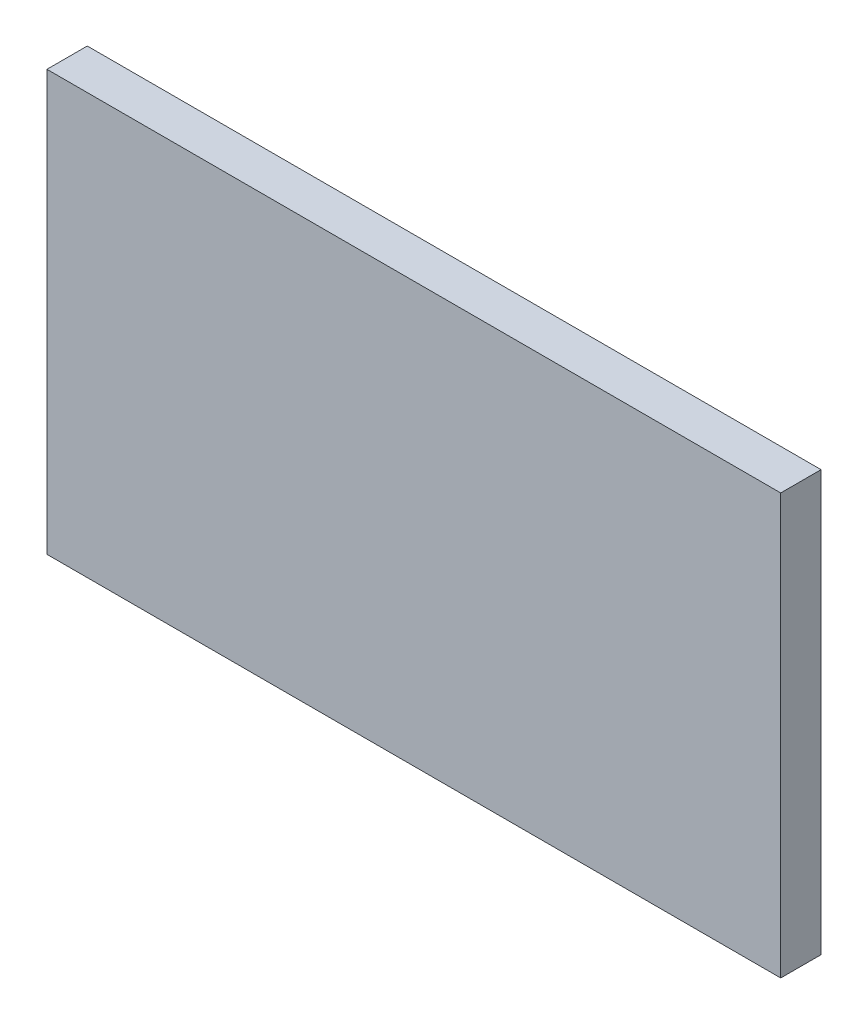
ISO-10303-21;
HEADER;
FILE_DESCRIPTION(('STEP AP214'),'2;1');
FILE_NAME('part.step','',(''),(''),'','','');
FILE_SCHEMA(('AUTOMOTIVE_DESIGN { 1 0 10303 214 1 1 1 1 }'));
ENDSEC;
DATA;
#1=APPLICATION_CONTEXT('core data for automotive mechanical design processes');
#2=APPLICATION_PROTOCOL_DEFINITION('international standard','automotive_design',2000,#1);
#3=PRODUCT_CONTEXT('',#1,'mechanical');
#4=PRODUCT('Part','Part','',(#3));
#5=PRODUCT_RELATED_PRODUCT_CATEGORY('part','',(#4));
#6=PRODUCT_DEFINITION_FORMATION('','',#4);
#7=PRODUCT_DEFINITION_CONTEXT('part definition',#1,'design');
#8=PRODUCT_DEFINITION('design','',#6,#7);
#9=PRODUCT_DEFINITION_SHAPE('','',#8);
#10=(LENGTH_UNIT() NAMED_UNIT(*) SI_UNIT(.MILLI.,.METRE.));
#11=(NAMED_UNIT(*) PLANE_ANGLE_UNIT() SI_UNIT($,.RADIAN.));
#12=(NAMED_UNIT(*) SI_UNIT($,.STERADIAN.) SOLID_ANGLE_UNIT());
#13=UNCERTAINTY_MEASURE_WITH_UNIT(LENGTH_MEASURE(1.E-05),#10,'distance_accuracy_value','');
#14=(GEOMETRIC_REPRESENTATION_CONTEXT(3) GLOBAL_UNCERTAINTY_ASSIGNED_CONTEXT((#13)) GLOBAL_UNIT_ASSIGNED_CONTEXT((#10,
#11,#12)) REPRESENTATION_CONTEXT('',''));
#15=CARTESIAN_POINT('',(0.,0.,0.));
#16=DIRECTION('',(0.,0.,1.));
#17=DIRECTION('',(1.,0.,0.));
#18=AXIS2_PLACEMENT_3D('',#15,#16,#17);
#19=CARTESIAN_POINT('',(-90.960971411902,-52.0748162193699,10.));
#20=DIRECTION('',(1.,0.,0.));
#21=DIRECTION('',(0.,0.,-1.));
#22=AXIS2_PLACEMENT_3D('',#19,#20,#21);
#23=PLANE('',#22);
#24=DIRECTION('',(0.,-1.,0.));
#25=VECTOR('',#24,1.);
#26=CARTESIAN_POINT('',(-90.960971411902,-52.0748162193699,0.));
#27=LINE('',#26,#25);
#28=CARTESIAN_POINT('',(-90.960971411902,52.0748162193699,0.));
#29=VERTEX_POINT('',#28);
#30=CARTESIAN_POINT('',(-90.960971411902,-52.0748162193699,0.));
#31=VERTEX_POINT('',#30);
#32=EDGE_CURVE('E96',#29,#31,#27,.T.);
#33=ORIENTED_EDGE('',*,*,#32,.T.);
#34=DIRECTION('',(0.,0.,-1.));
#35=VECTOR('',#34,1.);
#36=CARTESIAN_POINT('',(-90.960971411902,-52.0748162193699,10.));
#37=LINE('',#36,#35);
#38=CARTESIAN_POINT('',(-90.960971411902,-52.0748162193699,10.));
#39=VERTEX_POINT('',#38);
#40=EDGE_CURVE('E11',#39,#31,#37,.T.);
#41=ORIENTED_EDGE('',*,*,#40,.F.);
#42=DIRECTION('',(0.,-1.,0.));
#43=VECTOR('',#42,1.);
#44=CARTESIAN_POINT('',(-90.960971411902,-52.0748162193699,10.));
#45=LINE('',#44,#43);
#46=CARTESIAN_POINT('',(-90.960971411902,52.0748162193699,10.));
#47=VERTEX_POINT('',#46);
#48=EDGE_CURVE('E84',#47,#39,#45,.T.);
#49=ORIENTED_EDGE('',*,*,#48,.F.);
#50=DIRECTION('',(0.,0.,-1.));
#51=VECTOR('',#50,1.);
#52=CARTESIAN_POINT('',(-90.960971411902,52.0748162193699,10.));
#53=LINE('',#52,#51);
#54=EDGE_CURVE('E92',#47,#29,#53,.T.);
#55=ORIENTED_EDGE('',*,*,#54,.T.);
#56=EDGE_LOOP('',(#33,#41,#49,#55));
#57=FACE_BOUND('',#56,.T.);
#58=ADVANCED_FACE('F33',(#57),#23,.F.);
#59=CARTESIAN_POINT('',(90.960971411902,-52.0748162193699,10.));
#60=DIRECTION('',(0.,1.,0.));
#61=DIRECTION('',(0.,0.,1.));
#62=AXIS2_PLACEMENT_3D('',#59,#60,#61);
#63=PLANE('',#62);
#64=DIRECTION('',(1.,0.,0.));
#65=VECTOR('',#64,1.);
#66=CARTESIAN_POINT('',(90.960971411902,-52.0748162193699,0.));
#67=LINE('',#66,#65);
#68=CARTESIAN_POINT('',(90.960971411902,-52.0748162193699,0.));
#69=VERTEX_POINT('',#68);
#70=EDGE_CURVE('E88',#31,#69,#67,.T.);
#71=ORIENTED_EDGE('',*,*,#70,.T.);
#72=DIRECTION('',(0.,0.,-1.));
#73=VECTOR('',#72,1.);
#74=CARTESIAN_POINT('',(90.960971411902,-52.0748162193699,10.));
#75=LINE('',#74,#73);
#76=CARTESIAN_POINT('',(90.960971411902,-52.0748162193699,10.));
#77=VERTEX_POINT('',#76);
#78=EDGE_CURVE('E41',#77,#69,#75,.T.);
#79=ORIENTED_EDGE('',*,*,#78,.F.);
#80=DIRECTION('',(1.,0.,0.));
#81=VECTOR('',#80,1.);
#82=CARTESIAN_POINT('',(90.960971411902,-52.0748162193699,10.));
#83=LINE('',#82,#81);
#84=EDGE_CURVE('E79',#39,#77,#83,.T.);
#85=ORIENTED_EDGE('',*,*,#84,.F.);
#86=ORIENTED_EDGE('',*,*,#40,.T.);
#87=EDGE_LOOP('',(#71,#79,#85,#86));
#88=FACE_BOUND('',#87,.T.);
#89=ADVANCED_FACE('F87',(#88),#63,.F.);
#90=CARTESIAN_POINT('',(90.960971411902,-52.0748162193699,10.));
#91=DIRECTION('',(-1.,0.,0.));
#92=DIRECTION('',(0.,0.,1.));
#93=AXIS2_PLACEMENT_3D('',#90,#91,#92);
#94=PLANE('',#93);
#95=DIRECTION('',(0.,1.,0.));
#96=VECTOR('',#95,1.);
#97=CARTESIAN_POINT('',(90.960971411902,-52.0748162193699,0.));
#98=LINE('',#97,#96);
#99=CARTESIAN_POINT('',(90.960971411902,52.0748162193699,0.));
#100=VERTEX_POINT('',#99);
#101=EDGE_CURVE('E66',#69,#100,#98,.T.);
#102=ORIENTED_EDGE('',*,*,#101,.T.);
#103=DIRECTION('',(0.,0.,-1.));
#104=VECTOR('',#103,1.);
#105=CARTESIAN_POINT('',(90.960971411902,52.0748162193699,10.));
#106=LINE('',#105,#104);
#107=CARTESIAN_POINT('',(90.960971411902,52.0748162193699,10.));
#108=VERTEX_POINT('',#107);
#109=EDGE_CURVE('E89',#108,#100,#106,.T.);
#110=ORIENTED_EDGE('',*,*,#109,.F.);
#111=DIRECTION('',(0.,1.,0.));
#112=VECTOR('',#111,1.);
#113=CARTESIAN_POINT('',(90.960971411902,-52.0748162193699,10.));
#114=LINE('',#113,#112);
#115=EDGE_CURVE('E82',#77,#108,#114,.T.);
#116=ORIENTED_EDGE('',*,*,#115,.F.);
#117=ORIENTED_EDGE('',*,*,#78,.T.);
#118=EDGE_LOOP('',(#102,#110,#116,#117));
#119=FACE_BOUND('',#118,.T.);
#120=ADVANCED_FACE('F90',(#119),#94,.F.);
#121=CARTESIAN_POINT('',(90.960971411902,52.0748162193699,10.));
#122=DIRECTION('',(0.,-1.,0.));
#123=DIRECTION('',(0.,0.,-1.));
#124=AXIS2_PLACEMENT_3D('',#121,#122,#123);
#125=PLANE('',#124);
#126=DIRECTION('',(-1.,0.,0.));
#127=VECTOR('',#126,1.);
#128=CARTESIAN_POINT('',(90.960971411902,52.0748162193699,0.));
#129=LINE('',#128,#127);
#130=EDGE_CURVE('E72',#100,#29,#129,.T.);
#131=ORIENTED_EDGE('',*,*,#130,.T.);
#132=ORIENTED_EDGE('',*,*,#54,.F.);
#133=DIRECTION('',(-1.,0.,0.));
#134=VECTOR('',#133,1.);
#135=CARTESIAN_POINT('',(90.960971411902,52.0748162193699,10.));
#136=LINE('',#135,#134);
#137=EDGE_CURVE('E49',#108,#47,#136,.T.);
#138=ORIENTED_EDGE('',*,*,#137,.F.);
#139=ORIENTED_EDGE('',*,*,#109,.T.);
#140=EDGE_LOOP('',(#131,#132,#138,#139));
#141=FACE_BOUND('',#140,.T.);
#142=ADVANCED_FACE('F103',(#141),#125,.F.);
#143=CARTESIAN_POINT('',(0.,0.,10.));
#144=DIRECTION('',(0.,0.,1.));
#145=DIRECTION('',(1.,0.,0.));
#146=AXIS2_PLACEMENT_3D('',#143,#144,#145);
#147=PLANE('',#146);
#148=ORIENTED_EDGE('',*,*,#48,.T.);
#149=ORIENTED_EDGE('',*,*,#84,.T.);
#150=ORIENTED_EDGE('',*,*,#115,.T.);
#151=ORIENTED_EDGE('',*,*,#137,.T.);
#152=EDGE_LOOP('',(#148,#149,#150,#151));
#153=FACE_BOUND('',#152,.T.);
#154=ADVANCED_FACE('F80',(#153),#147,.T.);
#155=CARTESIAN_POINT('',(0.,0.,0.));
#156=DIRECTION('',(0.,0.,1.));
#157=DIRECTION('',(1.,0.,0.));
#158=AXIS2_PLACEMENT_3D('',#155,#156,#157);
#159=PLANE('',#158);
#160=ORIENTED_EDGE('',*,*,#32,.F.);
#161=ORIENTED_EDGE('',*,*,#130,.F.);
#162=ORIENTED_EDGE('',*,*,#101,.F.);
#163=ORIENTED_EDGE('',*,*,#70,.F.);
#164=EDGE_LOOP('',(#160,#161,#162,#163));
#165=FACE_BOUND('',#164,.T.);
#166=ADVANCED_FACE('F106',(#165),#159,.F.);
#167=CLOSED_SHELL('',(#58,#89,#120,#142,#154,#166));
#168=MANIFOLD_SOLID_BREP('B2',#167);
#169=ADVANCED_BREP_SHAPE_REPRESENTATION('',(#18,#168),#14);
#170=SHAPE_DEFINITION_REPRESENTATION(#9,#169);
ENDSEC;
END-ISO-10303-21;
